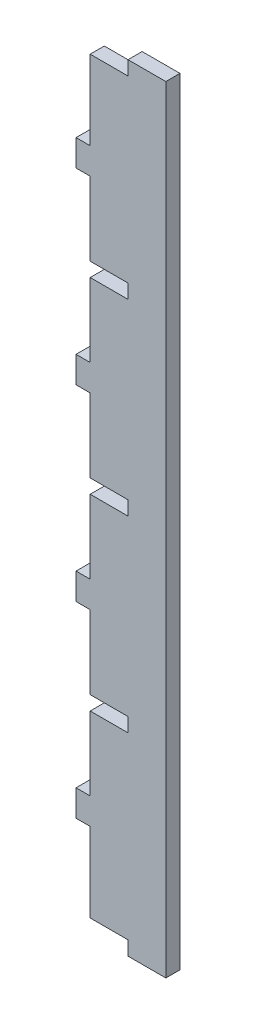
ISO-10303-21;
HEADER;
FILE_DESCRIPTION(('STEP AP214'),'2;1');
FILE_NAME('part.step','',(''),(''),'','','');
FILE_SCHEMA(('AUTOMOTIVE_DESIGN { 1 0 10303 214 1 1 1 1 }'));
ENDSEC;
DATA;
#1=APPLICATION_CONTEXT('core data for automotive mechanical design processes');
#2=APPLICATION_PROTOCOL_DEFINITION('international standard','automotive_design',2000,#1);
#3=PRODUCT_CONTEXT('',#1,'mechanical');
#4=PRODUCT('Part','Part','',(#3));
#5=PRODUCT_RELATED_PRODUCT_CATEGORY('part','',(#4));
#6=PRODUCT_DEFINITION_FORMATION('','',#4);
#7=PRODUCT_DEFINITION_CONTEXT('part definition',#1,'design');
#8=PRODUCT_DEFINITION('design','',#6,#7);
#9=PRODUCT_DEFINITION_SHAPE('','',#8);
#10=(LENGTH_UNIT() NAMED_UNIT(*) SI_UNIT(.MILLI.,.METRE.));
#11=(NAMED_UNIT(*) PLANE_ANGLE_UNIT() SI_UNIT($,.RADIAN.));
#12=(NAMED_UNIT(*) SI_UNIT($,.STERADIAN.) SOLID_ANGLE_UNIT());
#13=UNCERTAINTY_MEASURE_WITH_UNIT(LENGTH_MEASURE(1.E-05),#10,'distance_accuracy_value','');
#14=(GEOMETRIC_REPRESENTATION_CONTEXT(3) GLOBAL_UNCERTAINTY_ASSIGNED_CONTEXT((#13)) GLOBAL_UNIT_ASSIGNED_CONTEXT((#10,
#11,#12)) REPRESENTATION_CONTEXT('',''));
#15=CARTESIAN_POINT('',(0.,0.,0.));
#16=DIRECTION('',(0.,0.,1.));
#17=DIRECTION('',(1.,0.,0.));
#18=AXIS2_PLACEMENT_3D('',#15,#16,#17);
#19=CARTESIAN_POINT('',(5.34999929369997,5.3500086069,5.35));
#20=DIRECTION('',(0.,1.,0.));
#21=DIRECTION('',(0.,0.,1.));
#22=AXIS2_PLACEMENT_3D('',#19,#20,#21);
#23=PLANE('',#22);
#24=DIRECTION('',(1.,0.,0.));
#25=VECTOR('',#24,1.);
#26=CARTESIAN_POINT('',(5.34999929369997,5.3500086069,0.));
#27=LINE('',#26,#25);
#28=CARTESIAN_POINT('',(5.34999929369997,5.3500086069,0.));
#29=VERTEX_POINT('',#28);
#30=CARTESIAN_POINT('',(19.674999232,5.3500086069,0.));
#31=VERTEX_POINT('',#30);
#32=EDGE_CURVE('E297',#29,#31,#27,.T.);
#33=ORIENTED_EDGE('',*,*,#32,.T.);
#34=DIRECTION('',(0.,0.,-1.));
#35=VECTOR('',#34,1.);
#36=CARTESIAN_POINT('',(19.674999232,5.3500086069,5.35));
#37=LINE('',#36,#35);
#38=CARTESIAN_POINT('',(19.674999232,5.3500086069,5.35));
#39=VERTEX_POINT('',#38);
#40=EDGE_CURVE('E11',#39,#31,#37,.T.);
#41=ORIENTED_EDGE('',*,*,#40,.F.);
#42=DIRECTION('',(1.,0.,0.));
#43=VECTOR('',#42,1.);
#44=CARTESIAN_POINT('',(5.34999929369997,5.3500086069,5.35));
#45=LINE('',#44,#43);
#46=CARTESIAN_POINT('',(5.34999929369997,5.3500086069,5.35));
#47=VERTEX_POINT('',#46);
#48=EDGE_CURVE('E367',#47,#39,#45,.T.);
#49=ORIENTED_EDGE('',*,*,#48,.F.);
#50=DIRECTION('',(0.,0.,-1.));
#51=VECTOR('',#50,1.);
#52=CARTESIAN_POINT('',(5.34999929369997,5.3500086069,5.35));
#53=LINE('',#52,#51);
#54=EDGE_CURVE('E293',#47,#29,#53,.T.);
#55=ORIENTED_EDGE('',*,*,#54,.T.);
#56=EDGE_LOOP('',(#33,#41,#49,#55));
#57=FACE_BOUND('',#56,.T.);
#58=ADVANCED_FACE('F33',(#57),#23,.F.);
#59=CARTESIAN_POINT('',(19.674999232,5.3500086069,5.35));
#60=DIRECTION('',(1.,0.,0.));
#61=DIRECTION('',(0.,0.,-1.));
#62=AXIS2_PLACEMENT_3D('',#59,#60,#61);
#63=PLANE('',#62);
#64=DIRECTION('',(0.,-1.,0.));
#65=VECTOR('',#64,1.);
#66=CARTESIAN_POINT('',(19.674999232,5.3500086069,0.));
#67=LINE('',#66,#65);
#68=CARTESIAN_POINT('',(19.674999232,0.,0.));
#69=VERTEX_POINT('',#68);
#70=EDGE_CURVE('E300',#31,#69,#67,.T.);
#71=ORIENTED_EDGE('',*,*,#70,.T.);
#72=DIRECTION('',(0.,0.,-1.));
#73=VECTOR('',#72,1.);
#74=CARTESIAN_POINT('',(19.674999232,0.,5.35));
#75=LINE('',#74,#73);
#76=CARTESIAN_POINT('',(19.674999232,0.,5.35));
#77=VERTEX_POINT('',#76);
#78=EDGE_CURVE('E41',#77,#69,#75,.T.);
#79=ORIENTED_EDGE('',*,*,#78,.F.);
#80=DIRECTION('',(0.,-1.,0.));
#81=VECTOR('',#80,1.);
#82=CARTESIAN_POINT('',(19.674999232,5.3500086069,5.35));
#83=LINE('',#82,#81);
#84=EDGE_CURVE('E176',#39,#77,#83,.T.);
#85=ORIENTED_EDGE('',*,*,#84,.F.);
#86=ORIENTED_EDGE('',*,*,#40,.T.);
#87=EDGE_LOOP('',(#71,#79,#85,#86));
#88=FACE_BOUND('',#87,.T.);
#89=ADVANCED_FACE('F565',(#88),#63,.F.);
#90=CARTESIAN_POINT('',(19.674999232,0.,5.35));
#91=DIRECTION('',(0.,1.,0.));
#92=DIRECTION('',(0.,0.,1.));
#93=AXIS2_PLACEMENT_3D('',#90,#91,#92);
#94=PLANE('',#93);
#95=DIRECTION('',(1.,0.,0.));
#96=VECTOR('',#95,1.);
#97=CARTESIAN_POINT('',(19.674999232,0.,0.));
#98=LINE('',#97,#96);
#99=CARTESIAN_POINT('',(33.9999990538,0.,0.));
#100=VERTEX_POINT('',#99);
#101=EDGE_CURVE('E302',#69,#100,#98,.T.);
#102=ORIENTED_EDGE('',*,*,#101,.T.);
#103=DIRECTION('',(0.,0.,-1.));
#104=VECTOR('',#103,1.);
#105=CARTESIAN_POINT('',(33.9999990538,0.,5.35));
#106=LINE('',#105,#104);
#107=CARTESIAN_POINT('',(33.9999990538,0.,5.35));
#108=VERTEX_POINT('',#107);
#109=EDGE_CURVE('E458',#108,#100,#106,.T.);
#110=ORIENTED_EDGE('',*,*,#109,.F.);
#111=DIRECTION('',(1.,0.,0.));
#112=VECTOR('',#111,1.);
#113=CARTESIAN_POINT('',(19.674999232,0.,5.35));
#114=LINE('',#113,#112);
#115=EDGE_CURVE('E466',#77,#108,#114,.T.);
#116=ORIENTED_EDGE('',*,*,#115,.F.);
#117=ORIENTED_EDGE('',*,*,#78,.T.);
#118=EDGE_LOOP('',(#102,#110,#116,#117));
#119=FACE_BOUND('',#118,.T.);
#120=ADVANCED_FACE('F464',(#119),#94,.F.);
#121=CARTESIAN_POINT('',(33.9999990538,0.,5.35));
#122=DIRECTION('',(-1.,0.,0.));
#123=DIRECTION('',(0.,0.,1.));
#124=AXIS2_PLACEMENT_3D('',#121,#122,#123);
#125=PLANE('',#124);
#126=DIRECTION('',(0.,1.,0.));
#127=VECTOR('',#126,1.);
#128=CARTESIAN_POINT('',(33.9999990538,0.,0.));
#129=LINE('',#128,#127);
#130=CARTESIAN_POINT('',(33.9999990538,293.9999997616,0.));
#131=VERTEX_POINT('',#130);
#132=EDGE_CURVE('E304',#100,#131,#129,.T.);
#133=ORIENTED_EDGE('',*,*,#132,.T.);
#134=DIRECTION('',(0.,0.,-1.));
#135=VECTOR('',#134,1.);
#136=CARTESIAN_POINT('',(33.9999990538,293.9999997616,5.35));
#137=LINE('',#136,#135);
#138=CARTESIAN_POINT('',(33.9999990538,293.9999997616,5.35));
#139=VERTEX_POINT('',#138);
#140=EDGE_CURVE('E455',#139,#131,#137,.T.);
#141=ORIENTED_EDGE('',*,*,#140,.F.);
#142=DIRECTION('',(0.,1.,0.));
#143=VECTOR('',#142,1.);
#144=CARTESIAN_POINT('',(33.9999990538,0.,5.35));
#145=LINE('',#144,#143);
#146=EDGE_CURVE('E484',#108,#139,#145,.T.);
#147=ORIENTED_EDGE('',*,*,#146,.F.);
#148=ORIENTED_EDGE('',*,*,#109,.T.);
#149=EDGE_LOOP('',(#133,#141,#147,#148));
#150=FACE_BOUND('',#149,.T.);
#151=ADVANCED_FACE('F475',(#150),#125,.F.);
#152=CARTESIAN_POINT('',(33.9999990538,293.9999997616,5.35));
#153=DIRECTION('',(0.,-1.,0.));
#154=DIRECTION('',(0.,0.,-1.));
#155=AXIS2_PLACEMENT_3D('',#152,#153,#154);
#156=PLANE('',#155);
#157=DIRECTION('',(-1.,0.,0.));
#158=VECTOR('',#157,1.);
#159=CARTESIAN_POINT('',(33.9999990538,293.9999997616,0.));
#160=LINE('',#159,#158);
#161=CARTESIAN_POINT('',(19.674999232,293.9999997616,0.));
#162=VERTEX_POINT('',#161);
#163=EDGE_CURVE('E306',#131,#162,#160,.T.);
#164=ORIENTED_EDGE('',*,*,#163,.T.);
#165=DIRECTION('',(0.,0.,-1.));
#166=VECTOR('',#165,1.);
#167=CARTESIAN_POINT('',(19.674999232,293.9999997616,5.35));
#168=LINE('',#167,#166);
#169=CARTESIAN_POINT('',(19.674999232,293.9999997616,5.35));
#170=VERTEX_POINT('',#169);
#171=EDGE_CURVE('E452',#170,#162,#168,.T.);
#172=ORIENTED_EDGE('',*,*,#171,.F.);
#173=DIRECTION('',(-1.,0.,0.));
#174=VECTOR('',#173,1.);
#175=CARTESIAN_POINT('',(33.9999990538,293.9999997616,5.35));
#176=LINE('',#175,#174);
#177=EDGE_CURVE('E481',#139,#170,#176,.T.);
#178=ORIENTED_EDGE('',*,*,#177,.F.);
#179=ORIENTED_EDGE('',*,*,#140,.T.);
#180=EDGE_LOOP('',(#164,#172,#178,#179));
#181=FACE_BOUND('',#180,.T.);
#182=ADVANCED_FACE('F479',(#181),#156,.F.);
#183=CARTESIAN_POINT('',(19.674999232,293.9999997616,5.35));
#184=DIRECTION('',(1.,0.,0.));
#185=DIRECTION('',(0.,0.,-1.));
#186=AXIS2_PLACEMENT_3D('',#183,#184,#185);
#187=PLANE('',#186);
#188=DIRECTION('',(0.,-1.,0.));
#189=VECTOR('',#188,1.);
#190=CARTESIAN_POINT('',(19.674999232,293.9999997616,0.));
#191=LINE('',#190,#189);
#192=CARTESIAN_POINT('',(19.674999232,288.6500060559,0.));
#193=VERTEX_POINT('',#192);
#194=EDGE_CURVE('E308',#162,#193,#191,.T.);
#195=ORIENTED_EDGE('',*,*,#194,.T.);
#196=DIRECTION('',(0.,0.,-1.));
#197=VECTOR('',#196,1.);
#198=CARTESIAN_POINT('',(19.674999232,288.6500060559,5.35));
#199=LINE('',#198,#197);
#200=CARTESIAN_POINT('',(19.674999232,288.6500060559,5.35));
#201=VERTEX_POINT('',#200);
#202=EDGE_CURVE('E449',#201,#193,#199,.T.);
#203=ORIENTED_EDGE('',*,*,#202,.F.);
#204=DIRECTION('',(0.,-1.,0.));
#205=VECTOR('',#204,1.);
#206=CARTESIAN_POINT('',(19.674999232,293.9999997616,5.35));
#207=LINE('',#206,#205);
#208=EDGE_CURVE('E483',#170,#201,#207,.T.);
#209=ORIENTED_EDGE('',*,*,#208,.F.);
#210=ORIENTED_EDGE('',*,*,#171,.T.);
#211=EDGE_LOOP('',(#195,#203,#209,#210));
#212=FACE_BOUND('',#211,.T.);
#213=ADVANCED_FACE('F578',(#212),#187,.F.);
#214=CARTESIAN_POINT('',(19.674999232,288.6500060559,5.35));
#215=DIRECTION('',(0.,-1.,0.));
#216=DIRECTION('',(0.,0.,-1.));
#217=AXIS2_PLACEMENT_3D('',#214,#215,#216);
#218=PLANE('',#217);
#219=DIRECTION('',(-1.,0.,0.));
#220=VECTOR('',#219,1.);
#221=CARTESIAN_POINT('',(19.674999232,288.6500060559,0.));
#222=LINE('',#221,#220);
#223=CARTESIAN_POINT('',(5.34999929369997,288.6500060559,0.));
#224=VERTEX_POINT('',#223);
#225=EDGE_CURVE('E310',#193,#224,#222,.T.);
#226=ORIENTED_EDGE('',*,*,#225,.T.);
#227=DIRECTION('',(0.,0.,-1.));
#228=VECTOR('',#227,1.);
#229=CARTESIAN_POINT('',(5.34999929369997,288.6500060559,5.35));
#230=LINE('',#229,#228);
#231=CARTESIAN_POINT('',(5.34999929369997,288.6500060559,5.35));
#232=VERTEX_POINT('',#231);
#233=EDGE_CURVE('E446',#232,#224,#230,.T.);
#234=ORIENTED_EDGE('',*,*,#233,.F.);
#235=DIRECTION('',(-1.,0.,0.));
#236=VECTOR('',#235,1.);
#237=CARTESIAN_POINT('',(19.674999232,288.6500060559,5.35));
#238=LINE('',#237,#236);
#239=EDGE_CURVE('E486',#201,#232,#238,.T.);
#240=ORIENTED_EDGE('',*,*,#239,.F.);
#241=ORIENTED_EDGE('',*,*,#202,.T.);
#242=EDGE_LOOP('',(#226,#234,#240,#241));
#243=FACE_BOUND('',#242,.T.);
#244=ADVANCED_FACE('F581',(#243),#218,.F.);
#245=CARTESIAN_POINT('',(5.34999929369997,288.6500060559,5.35));
#246=DIRECTION('',(1.,0.,0.));
#247=DIRECTION('',(0.,0.,-1.));
#248=AXIS2_PLACEMENT_3D('',#245,#246,#247);
#249=PLANE('',#248);
#250=DIRECTION('',(0.,-1.,0.));
#251=VECTOR('',#250,1.);
#252=CARTESIAN_POINT('',(5.34999929369997,288.6500060559,0.));
#253=LINE('',#252,#251);
#254=CARTESIAN_POINT('',(5.34999929369997,258.6180120707,0.));
#255=VERTEX_POINT('',#254);
#256=EDGE_CURVE('E312',#224,#255,#253,.T.);
#257=ORIENTED_EDGE('',*,*,#256,.T.);
#258=DIRECTION('',(0.,0.,-1.));
#259=VECTOR('',#258,1.);
#260=CARTESIAN_POINT('',(5.34999929369997,258.6180120707,5.35));
#261=LINE('',#260,#259);
#262=CARTESIAN_POINT('',(5.34999929369997,258.6180120707,5.35));
#263=VERTEX_POINT('',#262);
#264=EDGE_CURVE('E443',#263,#255,#261,.T.);
#265=ORIENTED_EDGE('',*,*,#264,.F.);
#266=DIRECTION('',(0.,-1.,0.));
#267=VECTOR('',#266,1.);
#268=CARTESIAN_POINT('',(5.34999929369997,288.6500060559,5.35));
#269=LINE('',#268,#267);
#270=EDGE_CURVE('E492',#232,#263,#269,.T.);
#271=ORIENTED_EDGE('',*,*,#270,.F.);
#272=ORIENTED_EDGE('',*,*,#233,.T.);
#273=EDGE_LOOP('',(#257,#265,#271,#272));
#274=FACE_BOUND('',#273,.T.);
#275=ADVANCED_FACE('F585',(#274),#249,.F.);
#276=CARTESIAN_POINT('',(5.34999929369997,258.6180120707,5.35));
#277=DIRECTION('',(0.,-1.,0.));
#278=DIRECTION('',(0.,0.,-1.));
#279=AXIS2_PLACEMENT_3D('',#276,#277,#278);
#280=PLANE('',#279);
#281=DIRECTION('',(-1.,0.,0.));
#282=VECTOR('',#281,1.);
#283=CARTESIAN_POINT('',(5.34999929369997,258.6180120707,0.));
#284=LINE('',#283,#282);
#285=CARTESIAN_POINT('',(0.,258.6180120707,0.));
#286=VERTEX_POINT('',#285);
#287=EDGE_CURVE('E314',#255,#286,#284,.T.);
#288=ORIENTED_EDGE('',*,*,#287,.T.);
#289=DIRECTION('',(0.,0.,-1.));
#290=VECTOR('',#289,1.);
#291=CARTESIAN_POINT('',(0.,258.6180120707,5.35));
#292=LINE('',#291,#290);
#293=CARTESIAN_POINT('',(0.,258.6180120707,5.35));
#294=VERTEX_POINT('',#293);
#295=EDGE_CURVE('E440',#294,#286,#292,.T.);
#296=ORIENTED_EDGE('',*,*,#295,.F.);
#297=DIRECTION('',(-1.,0.,0.));
#298=VECTOR('',#297,1.);
#299=CARTESIAN_POINT('',(5.34999929369997,258.6180120707,5.35));
#300=LINE('',#299,#298);
#301=EDGE_CURVE('E494',#263,#294,#300,.T.);
#302=ORIENTED_EDGE('',*,*,#301,.F.);
#303=ORIENTED_EDGE('',*,*,#264,.T.);
#304=EDGE_LOOP('',(#288,#296,#302,#303));
#305=FACE_BOUND('',#304,.T.);
#306=ADVANCED_FACE('F589',(#305),#280,.F.);
#307=CARTESIAN_POINT('',(0.,258.6180120707,5.35));
#308=DIRECTION('',(1.,0.,0.));
#309=DIRECTION('',(0.,0.,-1.));
#310=AXIS2_PLACEMENT_3D('',#307,#308,#309);
#311=PLANE('',#310);
#312=DIRECTION('',(0.,-1.,0.));
#313=VECTOR('',#312,1.);
#314=CARTESIAN_POINT('',(0.,258.6180120707,0.));
#315=LINE('',#314,#313);
#316=CARTESIAN_POINT('',(0.,248.6180067063,0.));
#317=VERTEX_POINT('',#316);
#318=EDGE_CURVE('E316',#286,#317,#315,.T.);
#319=ORIENTED_EDGE('',*,*,#318,.T.);
#320=DIRECTION('',(0.,0.,-1.));
#321=VECTOR('',#320,1.);
#322=CARTESIAN_POINT('',(0.,248.6180067063,5.35));
#323=LINE('',#322,#321);
#324=CARTESIAN_POINT('',(0.,248.6180067063,5.35));
#325=VERTEX_POINT('',#324);
#326=EDGE_CURVE('E437',#325,#317,#323,.T.);
#327=ORIENTED_EDGE('',*,*,#326,.F.);
#328=DIRECTION('',(0.,-1.,0.));
#329=VECTOR('',#328,1.);
#330=CARTESIAN_POINT('',(0.,258.6180120707,5.35));
#331=LINE('',#330,#329);
#332=EDGE_CURVE('E496',#294,#325,#331,.T.);
#333=ORIENTED_EDGE('',*,*,#332,.F.);
#334=ORIENTED_EDGE('',*,*,#295,.T.);
#335=EDGE_LOOP('',(#319,#327,#333,#334));
#336=FACE_BOUND('',#335,.T.);
#337=ADVANCED_FACE('F593',(#336),#311,.F.);
#338=CARTESIAN_POINT('',(0.,248.6180067063,5.35));
#339=DIRECTION('',(0.,1.,0.));
#340=DIRECTION('',(0.,0.,1.));
#341=AXIS2_PLACEMENT_3D('',#338,#339,#340);
#342=PLANE('',#341);
#343=DIRECTION('',(1.,0.,0.));
#344=VECTOR('',#343,1.);
#345=CARTESIAN_POINT('',(0.,248.6180067063,0.));
#346=LINE('',#345,#344);
#347=CARTESIAN_POINT('',(5.34999929369997,248.6180067063,0.));
#348=VERTEX_POINT('',#347);
#349=EDGE_CURVE('E318',#317,#348,#346,.T.);
#350=ORIENTED_EDGE('',*,*,#349,.T.);
#351=DIRECTION('',(0.,0.,-1.));
#352=VECTOR('',#351,1.);
#353=CARTESIAN_POINT('',(5.34999929369997,248.6180067063,5.35));
#354=LINE('',#353,#352);
#355=CARTESIAN_POINT('',(5.34999929369997,248.6180067063,5.35));
#356=VERTEX_POINT('',#355);
#357=EDGE_CURVE('E434',#356,#348,#354,.T.);
#358=ORIENTED_EDGE('',*,*,#357,.F.);
#359=DIRECTION('',(1.,0.,0.));
#360=VECTOR('',#359,1.);
#361=CARTESIAN_POINT('',(0.,248.6180067063,5.35));
#362=LINE('',#361,#360);
#363=EDGE_CURVE('E498',#325,#356,#362,.T.);
#364=ORIENTED_EDGE('',*,*,#363,.F.);
#365=ORIENTED_EDGE('',*,*,#326,.T.);
#366=EDGE_LOOP('',(#350,#358,#364,#365));
#367=FACE_BOUND('',#366,.T.);
#368=ADVANCED_FACE('F597',(#367),#342,.F.);
#369=CARTESIAN_POINT('',(5.34999929369997,248.6180067063,5.35));
#370=DIRECTION('',(1.,0.,0.));
#371=DIRECTION('',(0.,0.,-1.));
#372=AXIS2_PLACEMENT_3D('',#369,#370,#371);
#373=PLANE('',#372);
#374=DIRECTION('',(0.,-1.,0.));
#375=VECTOR('',#374,1.);
#376=CARTESIAN_POINT('',(5.34999929369997,248.6180067063,0.));
#377=LINE('',#376,#375);
#378=CARTESIAN_POINT('',(5.34999929369997,220.7536697388,0.));
#379=VERTEX_POINT('',#378);
#380=EDGE_CURVE('E320',#348,#379,#377,.T.);
#381=ORIENTED_EDGE('',*,*,#380,.T.);
#382=DIRECTION('',(0.,0.,-1.));
#383=VECTOR('',#382,1.);
#384=CARTESIAN_POINT('',(5.34999929369997,220.7536697388,5.35));
#385=LINE('',#384,#383);
#386=CARTESIAN_POINT('',(5.34999929369997,220.7536697388,5.35));
#387=VERTEX_POINT('',#386);
#388=EDGE_CURVE('E431',#387,#379,#385,.T.);
#389=ORIENTED_EDGE('',*,*,#388,.F.);
#390=DIRECTION('',(0.,-1.,0.));
#391=VECTOR('',#390,1.);
#392=CARTESIAN_POINT('',(5.34999929369997,248.6180067063,5.35));
#393=LINE('',#392,#391);
#394=EDGE_CURVE('E500',#356,#387,#393,.T.);
#395=ORIENTED_EDGE('',*,*,#394,.F.);
#396=ORIENTED_EDGE('',*,*,#357,.T.);
#397=EDGE_LOOP('',(#381,#389,#395,#396));
#398=FACE_BOUND('',#397,.T.);
#399=ADVANCED_FACE('F601',(#398),#373,.F.);
#400=CARTESIAN_POINT('',(5.34999929369997,220.7536697388,5.35));
#401=DIRECTION('',(0.,1.,0.));
#402=DIRECTION('',(0.,0.,1.));
#403=AXIS2_PLACEMENT_3D('',#400,#401,#402);
#404=PLANE('',#403);
#405=DIRECTION('',(1.,0.,0.));
#406=VECTOR('',#405,1.);
#407=CARTESIAN_POINT('',(5.34999929369997,220.7536697388,0.));
#408=LINE('',#407,#406);
#409=CARTESIAN_POINT('',(19.674999232,220.7536697388,0.));
#410=VERTEX_POINT('',#409);
#411=EDGE_CURVE('E322',#379,#410,#408,.T.);
#412=ORIENTED_EDGE('',*,*,#411,.T.);
#413=DIRECTION('',(0.,0.,-1.));
#414=VECTOR('',#413,1.);
#415=CARTESIAN_POINT('',(19.674999232,220.7536697388,5.35));
#416=LINE('',#415,#414);
#417=CARTESIAN_POINT('',(19.674999232,220.7536697388,5.35));
#418=VERTEX_POINT('',#417);
#419=EDGE_CURVE('E428',#418,#410,#416,.T.);
#420=ORIENTED_EDGE('',*,*,#419,.F.);
#421=DIRECTION('',(1.,0.,0.));
#422=VECTOR('',#421,1.);
#423=CARTESIAN_POINT('',(5.34999929369997,220.7536697388,5.35));
#424=LINE('',#423,#422);
#425=EDGE_CURVE('E502',#387,#418,#424,.T.);
#426=ORIENTED_EDGE('',*,*,#425,.F.);
#427=ORIENTED_EDGE('',*,*,#388,.T.);
#428=EDGE_LOOP('',(#412,#420,#426,#427));
#429=FACE_BOUND('',#428,.T.);
#430=ADVANCED_FACE('F605',(#429),#404,.F.);
#431=CARTESIAN_POINT('',(19.674999232,220.7536697388,5.35));
#432=DIRECTION('',(1.,0.,0.));
#433=DIRECTION('',(0.,0.,-1.));
#434=AXIS2_PLACEMENT_3D('',#431,#432,#433);
#435=PLANE('',#434);
#436=DIRECTION('',(0.,-1.,0.));
#437=VECTOR('',#436,1.);
#438=CARTESIAN_POINT('',(19.674999232,220.7536697388,0.));
#439=LINE('',#438,#437);
#440=CARTESIAN_POINT('',(19.674999232,215.4036760331,0.));
#441=VERTEX_POINT('',#440);
#442=EDGE_CURVE('E324',#410,#441,#439,.T.);
#443=ORIENTED_EDGE('',*,*,#442,.T.);
#444=DIRECTION('',(0.,0.,-1.));
#445=VECTOR('',#444,1.);
#446=CARTESIAN_POINT('',(19.674999232,215.4036760331,5.35));
#447=LINE('',#446,#445);
#448=CARTESIAN_POINT('',(19.674999232,215.4036760331,5.35));
#449=VERTEX_POINT('',#448);
#450=EDGE_CURVE('E425',#449,#441,#447,.T.);
#451=ORIENTED_EDGE('',*,*,#450,.F.);
#452=DIRECTION('',(0.,-1.,0.));
#453=VECTOR('',#452,1.);
#454=CARTESIAN_POINT('',(19.674999232,220.7536697388,5.35));
#455=LINE('',#454,#453);
#456=EDGE_CURVE('E504',#418,#449,#455,.T.);
#457=ORIENTED_EDGE('',*,*,#456,.F.);
#458=ORIENTED_EDGE('',*,*,#419,.T.);
#459=EDGE_LOOP('',(#443,#451,#457,#458));
#460=FACE_BOUND('',#459,.T.);
#461=ADVANCED_FACE('F609',(#460),#435,.F.);
#462=CARTESIAN_POINT('',(19.674999232,215.4036760331,5.35));
#463=DIRECTION('',(0.,-1.,0.));
#464=DIRECTION('',(0.,0.,-1.));
#465=AXIS2_PLACEMENT_3D('',#462,#463,#464);
#466=PLANE('',#465);
#467=DIRECTION('',(-1.,0.,0.));
#468=VECTOR('',#467,1.);
#469=CARTESIAN_POINT('',(19.674999232,215.4036760331,0.));
#470=LINE('',#469,#468);
#471=CARTESIAN_POINT('',(5.34999929369997,215.4036760331,0.));
#472=VERTEX_POINT('',#471);
#473=EDGE_CURVE('E326',#441,#472,#470,.T.);
#474=ORIENTED_EDGE('',*,*,#473,.T.);
#475=DIRECTION('',(0.,0.,-1.));
#476=VECTOR('',#475,1.);
#477=CARTESIAN_POINT('',(5.34999929369997,215.4036760331,5.35));
#478=LINE('',#477,#476);
#479=CARTESIAN_POINT('',(5.34999929369997,215.4036760331,5.35));
#480=VERTEX_POINT('',#479);
#481=EDGE_CURVE('E422',#480,#472,#478,.T.);
#482=ORIENTED_EDGE('',*,*,#481,.F.);
#483=DIRECTION('',(-1.,0.,0.));
#484=VECTOR('',#483,1.);
#485=CARTESIAN_POINT('',(19.674999232,215.4036760331,5.35));
#486=LINE('',#485,#484);
#487=EDGE_CURVE('E506',#449,#480,#486,.T.);
#488=ORIENTED_EDGE('',*,*,#487,.F.);
#489=ORIENTED_EDGE('',*,*,#450,.T.);
#490=EDGE_LOOP('',(#474,#482,#488,#489));
#491=FACE_BOUND('',#490,.T.);
#492=ADVANCED_FACE('F613',(#491),#466,.F.);
#493=CARTESIAN_POINT('',(5.34999929369997,215.4036760331,5.35));
#494=DIRECTION('',(1.,0.,0.));
#495=DIRECTION('',(0.,0.,-1.));
#496=AXIS2_PLACEMENT_3D('',#493,#494,#495);
#497=PLANE('',#496);
#498=DIRECTION('',(0.,-1.,0.));
#499=VECTOR('',#498,1.);
#500=CARTESIAN_POINT('',(5.34999929369997,215.4036760331,0.));
#501=LINE('',#500,#499);
#502=CARTESIAN_POINT('',(5.34999929369997,187.5393390656,0.));
#503=VERTEX_POINT('',#502);
#504=EDGE_CURVE('E328',#472,#503,#501,.T.);
#505=ORIENTED_EDGE('',*,*,#504,.T.);
#506=DIRECTION('',(0.,0.,-1.));
#507=VECTOR('',#506,1.);
#508=CARTESIAN_POINT('',(5.34999929369997,187.5393390656,5.35));
#509=LINE('',#508,#507);
#510=CARTESIAN_POINT('',(5.34999929369997,187.5393390656,5.35));
#511=VERTEX_POINT('',#510);
#512=EDGE_CURVE('E419',#511,#503,#509,.T.);
#513=ORIENTED_EDGE('',*,*,#512,.F.);
#514=DIRECTION('',(0.,-1.,0.));
#515=VECTOR('',#514,1.);
#516=CARTESIAN_POINT('',(5.34999929369997,215.4036760331,5.35));
#517=LINE('',#516,#515);
#518=EDGE_CURVE('E508',#480,#511,#517,.T.);
#519=ORIENTED_EDGE('',*,*,#518,.F.);
#520=ORIENTED_EDGE('',*,*,#481,.T.);
#521=EDGE_LOOP('',(#505,#513,#519,#520));
#522=FACE_BOUND('',#521,.T.);
#523=ADVANCED_FACE('F617',(#522),#497,.F.);
#524=CARTESIAN_POINT('',(5.34999929369997,187.5393390656,5.35));
#525=DIRECTION('',(0.,-1.,0.));
#526=DIRECTION('',(0.,0.,-1.));
#527=AXIS2_PLACEMENT_3D('',#524,#525,#526);
#528=PLANE('',#527);
#529=DIRECTION('',(-1.,0.,0.));
#530=VECTOR('',#529,1.);
#531=CARTESIAN_POINT('',(5.34999929369997,187.5393390656,0.));
#532=LINE('',#531,#530);
#533=CARTESIAN_POINT('',(0.,187.5393390656,0.));
#534=VERTEX_POINT('',#533);
#535=EDGE_CURVE('E330',#503,#534,#532,.T.);
#536=ORIENTED_EDGE('',*,*,#535,.T.);
#537=DIRECTION('',(0.,0.,-1.));
#538=VECTOR('',#537,1.);
#539=CARTESIAN_POINT('',(0.,187.5393390656,5.35));
#540=LINE('',#539,#538);
#541=CARTESIAN_POINT('',(0.,187.5393390656,5.35));
#542=VERTEX_POINT('',#541);
#543=EDGE_CURVE('E416',#542,#534,#540,.T.);
#544=ORIENTED_EDGE('',*,*,#543,.F.);
#545=DIRECTION('',(-1.,0.,0.));
#546=VECTOR('',#545,1.);
#547=CARTESIAN_POINT('',(5.34999929369997,187.5393390656,5.35));
#548=LINE('',#547,#546);
#549=EDGE_CURVE('E510',#511,#542,#548,.T.);
#550=ORIENTED_EDGE('',*,*,#549,.F.);
#551=ORIENTED_EDGE('',*,*,#512,.T.);
#552=EDGE_LOOP('',(#536,#544,#550,#551));
#553=FACE_BOUND('',#552,.T.);
#554=ADVANCED_FACE('F621',(#553),#528,.F.);
#555=CARTESIAN_POINT('',(0.,187.5393390656,5.35));
#556=DIRECTION('',(1.,0.,0.));
#557=DIRECTION('',(0.,0.,-1.));
#558=AXIS2_PLACEMENT_3D('',#555,#556,#557);
#559=PLANE('',#558);
#560=DIRECTION('',(0.,-1.,0.));
#561=VECTOR('',#560,1.);
#562=CARTESIAN_POINT('',(0.,187.5393390656,0.));
#563=LINE('',#562,#561);
#564=CARTESIAN_POINT('',(0.,177.5393411517,0.));
#565=VERTEX_POINT('',#564);
#566=EDGE_CURVE('E332',#534,#565,#563,.T.);
#567=ORIENTED_EDGE('',*,*,#566,.T.);
#568=DIRECTION('',(0.,0.,-1.));
#569=VECTOR('',#568,1.);
#570=CARTESIAN_POINT('',(0.,177.5393411517,5.35));
#571=LINE('',#570,#569);
#572=CARTESIAN_POINT('',(0.,177.5393411517,5.35));
#573=VERTEX_POINT('',#572);
#574=EDGE_CURVE('E413',#573,#565,#571,.T.);
#575=ORIENTED_EDGE('',*,*,#574,.F.);
#576=DIRECTION('',(0.,-1.,0.));
#577=VECTOR('',#576,1.);
#578=CARTESIAN_POINT('',(0.,187.5393390656,5.35));
#579=LINE('',#578,#577);
#580=EDGE_CURVE('E512',#542,#573,#579,.T.);
#581=ORIENTED_EDGE('',*,*,#580,.F.);
#582=ORIENTED_EDGE('',*,*,#543,.T.);
#583=EDGE_LOOP('',(#567,#575,#581,#582));
#584=FACE_BOUND('',#583,.T.);
#585=ADVANCED_FACE('F625',(#584),#559,.F.);
#586=CARTESIAN_POINT('',(0.,177.5393411517,5.35));
#587=DIRECTION('',(0.,1.,0.));
#588=DIRECTION('',(0.,0.,1.));
#589=AXIS2_PLACEMENT_3D('',#586,#587,#588);
#590=PLANE('',#589);
#591=DIRECTION('',(1.,0.,0.));
#592=VECTOR('',#591,1.);
#593=CARTESIAN_POINT('',(0.,177.5393411517,0.));
#594=LINE('',#593,#592);
#595=CARTESIAN_POINT('',(5.34999929369997,177.5393411517,0.));
#596=VERTEX_POINT('',#595);
#597=EDGE_CURVE('E334',#565,#596,#594,.T.);
#598=ORIENTED_EDGE('',*,*,#597,.T.);
#599=DIRECTION('',(0.,0.,-1.));
#600=VECTOR('',#599,1.);
#601=CARTESIAN_POINT('',(5.34999929369997,177.5393411517,5.35));
#602=LINE('',#601,#600);
#603=CARTESIAN_POINT('',(5.34999929369997,177.5393411517,5.35));
#604=VERTEX_POINT('',#603);
#605=EDGE_CURVE('E410',#604,#596,#602,.T.);
#606=ORIENTED_EDGE('',*,*,#605,.F.);
#607=DIRECTION('',(1.,0.,0.));
#608=VECTOR('',#607,1.);
#609=CARTESIAN_POINT('',(0.,177.5393411517,5.35));
#610=LINE('',#609,#608);
#611=EDGE_CURVE('E514',#573,#604,#610,.T.);
#612=ORIENTED_EDGE('',*,*,#611,.F.);
#613=ORIENTED_EDGE('',*,*,#574,.T.);
#614=EDGE_LOOP('',(#598,#606,#612,#613));
#615=FACE_BOUND('',#614,.T.);
#616=ADVANCED_FACE('F629',(#615),#590,.F.);
#617=CARTESIAN_POINT('',(5.34999929369997,177.5393411517,5.35));
#618=DIRECTION('',(1.,0.,0.));
#619=DIRECTION('',(0.,0.,-1.));
#620=AXIS2_PLACEMENT_3D('',#617,#618,#619);
#621=PLANE('',#620);
#622=DIRECTION('',(0.,-1.,0.));
#623=VECTOR('',#622,1.);
#624=CARTESIAN_POINT('',(5.34999929369997,177.5393411517,0.));
#625=LINE('',#624,#623);
#626=CARTESIAN_POINT('',(5.34999929369997,149.6750060469,0.));
#627=VERTEX_POINT('',#626);
#628=EDGE_CURVE('E336',#596,#627,#625,.T.);
#629=ORIENTED_EDGE('',*,*,#628,.T.);
#630=DIRECTION('',(0.,0.,-1.));
#631=VECTOR('',#630,1.);
#632=CARTESIAN_POINT('',(5.34999929369997,149.6750060469,5.35));
#633=LINE('',#632,#631);
#634=CARTESIAN_POINT('',(5.34999929369997,149.6750060469,5.35));
#635=VERTEX_POINT('',#634);
#636=EDGE_CURVE('E407',#635,#627,#633,.T.);
#637=ORIENTED_EDGE('',*,*,#636,.F.);
#638=DIRECTION('',(0.,-1.,0.));
#639=VECTOR('',#638,1.);
#640=CARTESIAN_POINT('',(5.34999929369997,177.5393411517,5.35));
#641=LINE('',#640,#639);
#642=EDGE_CURVE('E516',#604,#635,#641,.T.);
#643=ORIENTED_EDGE('',*,*,#642,.F.);
#644=ORIENTED_EDGE('',*,*,#605,.T.);
#645=EDGE_LOOP('',(#629,#637,#643,#644));
#646=FACE_BOUND('',#645,.T.);
#647=ADVANCED_FACE('F633',(#646),#621,.F.);
#648=CARTESIAN_POINT('',(5.34999929369997,149.6750060469,5.35));
#649=DIRECTION('',(0.,1.,0.));
#650=DIRECTION('',(0.,0.,1.));
#651=AXIS2_PLACEMENT_3D('',#648,#649,#650);
#652=PLANE('',#651);
#653=DIRECTION('',(1.,0.,0.));
#654=VECTOR('',#653,1.);
#655=CARTESIAN_POINT('',(5.34999929369997,149.6750060469,0.));
#656=LINE('',#655,#654);
#657=CARTESIAN_POINT('',(19.674999232,149.6750060469,0.));
#658=VERTEX_POINT('',#657);
#659=EDGE_CURVE('E338',#627,#658,#656,.T.);
#660=ORIENTED_EDGE('',*,*,#659,.T.);
#661=DIRECTION('',(0.,0.,-1.));
#662=VECTOR('',#661,1.);
#663=CARTESIAN_POINT('',(19.674999232,149.6750060469,5.35));
#664=LINE('',#663,#662);
#665=CARTESIAN_POINT('',(19.674999232,149.6750060469,5.35));
#666=VERTEX_POINT('',#665);
#667=EDGE_CURVE('E404',#666,#658,#664,.T.);
#668=ORIENTED_EDGE('',*,*,#667,.F.);
#669=DIRECTION('',(1.,0.,0.));
#670=VECTOR('',#669,1.);
#671=CARTESIAN_POINT('',(5.34999929369997,149.6750060469,5.35));
#672=LINE('',#671,#670);
#673=EDGE_CURVE('E518',#635,#666,#672,.T.);
#674=ORIENTED_EDGE('',*,*,#673,.F.);
#675=ORIENTED_EDGE('',*,*,#636,.T.);
#676=EDGE_LOOP('',(#660,#668,#674,#675));
#677=FACE_BOUND('',#676,.T.);
#678=ADVANCED_FACE('F637',(#677),#652,.F.);
#679=CARTESIAN_POINT('',(19.674999232,149.6750060469,5.35));
#680=DIRECTION('',(1.,0.,0.));
#681=DIRECTION('',(0.,0.,-1.));
#682=AXIS2_PLACEMENT_3D('',#679,#680,#681);
#683=PLANE('',#682);
#684=DIRECTION('',(0.,-1.,0.));
#685=VECTOR('',#684,1.);
#686=CARTESIAN_POINT('',(19.674999232,149.6750060469,0.));
#687=LINE('',#686,#685);
#688=CARTESIAN_POINT('',(19.674999232,144.3250067532,0.));
#689=VERTEX_POINT('',#688);
#690=EDGE_CURVE('E340',#658,#689,#687,.T.);
#691=ORIENTED_EDGE('',*,*,#690,.T.);
#692=DIRECTION('',(0.,0.,-1.));
#693=VECTOR('',#692,1.);
#694=CARTESIAN_POINT('',(19.674999232,144.3250067532,5.35));
#695=LINE('',#694,#693);
#696=CARTESIAN_POINT('',(19.674999232,144.3250067532,5.35));
#697=VERTEX_POINT('',#696);
#698=EDGE_CURVE('E401',#697,#689,#695,.T.);
#699=ORIENTED_EDGE('',*,*,#698,.F.);
#700=DIRECTION('',(0.,-1.,0.));
#701=VECTOR('',#700,1.);
#702=CARTESIAN_POINT('',(19.674999232,149.6750060469,5.35));
#703=LINE('',#702,#701);
#704=EDGE_CURVE('E520',#666,#697,#703,.T.);
#705=ORIENTED_EDGE('',*,*,#704,.F.);
#706=ORIENTED_EDGE('',*,*,#667,.T.);
#707=EDGE_LOOP('',(#691,#699,#705,#706));
#708=FACE_BOUND('',#707,.T.);
#709=ADVANCED_FACE('F641',(#708),#683,.F.);
#710=CARTESIAN_POINT('',(19.674999232,144.3250067532,5.35));
#711=DIRECTION('',(0.,-1.,0.));
#712=DIRECTION('',(0.,0.,-1.));
#713=AXIS2_PLACEMENT_3D('',#710,#711,#712);
#714=PLANE('',#713);
#715=DIRECTION('',(-1.,0.,0.));
#716=VECTOR('',#715,1.);
#717=CARTESIAN_POINT('',(19.674999232,144.3250067532,0.));
#718=LINE('',#717,#716);
#719=CARTESIAN_POINT('',(5.34999929369997,144.3250067532,0.));
#720=VERTEX_POINT('',#719);
#721=EDGE_CURVE('E342',#689,#720,#718,.T.);
#722=ORIENTED_EDGE('',*,*,#721,.T.);
#723=DIRECTION('',(0.,0.,-1.));
#724=VECTOR('',#723,1.);
#725=CARTESIAN_POINT('',(5.34999929369997,144.3250067532,5.35));
#726=LINE('',#725,#724);
#727=CARTESIAN_POINT('',(5.34999929369997,144.3250067532,5.35));
#728=VERTEX_POINT('',#727);
#729=EDGE_CURVE('E398',#728,#720,#726,.T.);
#730=ORIENTED_EDGE('',*,*,#729,.F.);
#731=DIRECTION('',(-1.,0.,0.));
#732=VECTOR('',#731,1.);
#733=CARTESIAN_POINT('',(19.674999232,144.3250067532,5.35));
#734=LINE('',#733,#732);
#735=EDGE_CURVE('E522',#697,#728,#734,.T.);
#736=ORIENTED_EDGE('',*,*,#735,.F.);
#737=ORIENTED_EDGE('',*,*,#698,.T.);
#738=EDGE_LOOP('',(#722,#730,#736,#737));
#739=FACE_BOUND('',#738,.T.);
#740=ADVANCED_FACE('F645',(#739),#714,.F.);
#741=CARTESIAN_POINT('',(5.34999929369997,144.3250067532,5.35));
#742=DIRECTION('',(1.,0.,0.));
#743=DIRECTION('',(0.,0.,-1.));
#744=AXIS2_PLACEMENT_3D('',#741,#742,#743);
#745=PLANE('',#744);
#746=DIRECTION('',(0.,-1.,0.));
#747=VECTOR('',#746,1.);
#748=CARTESIAN_POINT('',(5.34999929369997,144.3250067532,0.));
#749=LINE('',#748,#747);
#750=CARTESIAN_POINT('',(5.34999929369997,116.4606725797,0.));
#751=VERTEX_POINT('',#750);
#752=EDGE_CURVE('E344',#720,#751,#749,.T.);
#753=ORIENTED_EDGE('',*,*,#752,.T.);
#754=DIRECTION('',(0.,0.,-1.));
#755=VECTOR('',#754,1.);
#756=CARTESIAN_POINT('',(5.34999929369997,116.4606725797,5.35));
#757=LINE('',#756,#755);
#758=CARTESIAN_POINT('',(5.34999929369997,116.4606725797,5.35));
#759=VERTEX_POINT('',#758);
#760=EDGE_CURVE('E395',#759,#751,#757,.T.);
#761=ORIENTED_EDGE('',*,*,#760,.F.);
#762=DIRECTION('',(0.,-1.,0.));
#763=VECTOR('',#762,1.);
#764=CARTESIAN_POINT('',(5.34999929369997,144.3250067532,5.35));
#765=LINE('',#764,#763);
#766=EDGE_CURVE('E524',#728,#759,#765,.T.);
#767=ORIENTED_EDGE('',*,*,#766,.F.);
#768=ORIENTED_EDGE('',*,*,#729,.T.);
#769=EDGE_LOOP('',(#753,#761,#767,#768));
#770=FACE_BOUND('',#769,.T.);
#771=ADVANCED_FACE('F649',(#770),#745,.F.);
#772=CARTESIAN_POINT('',(5.34999929369997,116.4606725797,5.35));
#773=DIRECTION('',(0.,-1.,0.));
#774=DIRECTION('',(0.,0.,-1.));
#775=AXIS2_PLACEMENT_3D('',#772,#773,#774);
#776=PLANE('',#775);
#777=DIRECTION('',(-1.,0.,0.));
#778=VECTOR('',#777,1.);
#779=CARTESIAN_POINT('',(5.34999929369997,116.4606725797,0.));
#780=LINE('',#779,#778);
#781=CARTESIAN_POINT('',(0.,116.4606725797,0.));
#782=VERTEX_POINT('',#781);
#783=EDGE_CURVE('E346',#751,#782,#780,.T.);
#784=ORIENTED_EDGE('',*,*,#783,.T.);
#785=DIRECTION('',(0.,0.,-1.));
#786=VECTOR('',#785,1.);
#787=CARTESIAN_POINT('',(0.,116.4606725797,5.35));
#788=LINE('',#787,#786);
#789=CARTESIAN_POINT('',(0.,116.4606725797,5.35));
#790=VERTEX_POINT('',#789);
#791=EDGE_CURVE('E392',#790,#782,#788,.T.);
#792=ORIENTED_EDGE('',*,*,#791,.F.);
#793=DIRECTION('',(-1.,0.,0.));
#794=VECTOR('',#793,1.);
#795=CARTESIAN_POINT('',(5.34999929369997,116.4606725797,5.35));
#796=LINE('',#795,#794);
#797=EDGE_CURVE('E526',#759,#790,#796,.T.);
#798=ORIENTED_EDGE('',*,*,#797,.F.);
#799=ORIENTED_EDGE('',*,*,#760,.T.);
#800=EDGE_LOOP('',(#784,#792,#798,#799));
#801=FACE_BOUND('',#800,.T.);
#802=ADVANCED_FACE('F653',(#801),#776,.F.);
#803=CARTESIAN_POINT('',(0.,116.4606725797,5.35));
#804=DIRECTION('',(1.,0.,0.));
#805=DIRECTION('',(0.,0.,-1.));
#806=AXIS2_PLACEMENT_3D('',#803,#804,#805);
#807=PLANE('',#806);
#808=DIRECTION('',(0.,-1.,0.));
#809=VECTOR('',#808,1.);
#810=CARTESIAN_POINT('',(0.,116.4606725797,0.));
#811=LINE('',#810,#809);
#812=CARTESIAN_POINT('',(0.,106.4606737346,0.));
#813=VERTEX_POINT('',#812);
#814=EDGE_CURVE('E348',#782,#813,#811,.T.);
#815=ORIENTED_EDGE('',*,*,#814,.T.);
#816=DIRECTION('',(0.,0.,-1.));
#817=VECTOR('',#816,1.);
#818=CARTESIAN_POINT('',(0.,106.4606737346,5.35));
#819=LINE('',#818,#817);
#820=CARTESIAN_POINT('',(0.,106.4606737346,5.35));
#821=VERTEX_POINT('',#820);
#822=EDGE_CURVE('E389',#821,#813,#819,.T.);
#823=ORIENTED_EDGE('',*,*,#822,.F.);
#824=DIRECTION('',(0.,-1.,0.));
#825=VECTOR('',#824,1.);
#826=CARTESIAN_POINT('',(0.,116.4606725797,5.35));
#827=LINE('',#826,#825);
#828=EDGE_CURVE('E528',#790,#821,#827,.T.);
#829=ORIENTED_EDGE('',*,*,#828,.F.);
#830=ORIENTED_EDGE('',*,*,#791,.T.);
#831=EDGE_LOOP('',(#815,#823,#829,#830));
#832=FACE_BOUND('',#831,.T.);
#833=ADVANCED_FACE('F657',(#832),#807,.F.);
#834=CARTESIAN_POINT('',(0.,106.4606737346,5.35));
#835=DIRECTION('',(0.,1.,0.));
#836=DIRECTION('',(0.,0.,1.));
#837=AXIS2_PLACEMENT_3D('',#834,#835,#836);
#838=PLANE('',#837);
#839=DIRECTION('',(1.,0.,0.));
#840=VECTOR('',#839,1.);
#841=CARTESIAN_POINT('',(0.,106.4606737346,0.));
#842=LINE('',#841,#840);
#843=CARTESIAN_POINT('',(5.34999929369997,106.4606737346,0.));
#844=VERTEX_POINT('',#843);
#845=EDGE_CURVE('E350',#813,#844,#842,.T.);
#846=ORIENTED_EDGE('',*,*,#845,.T.);
#847=DIRECTION('',(0.,0.,-1.));
#848=VECTOR('',#847,1.);
#849=CARTESIAN_POINT('',(5.34999929369997,106.4606737346,5.35));
#850=LINE('',#849,#848);
#851=CARTESIAN_POINT('',(5.34999929369997,106.4606737346,5.35));
#852=VERTEX_POINT('',#851);
#853=EDGE_CURVE('E386',#852,#844,#850,.T.);
#854=ORIENTED_EDGE('',*,*,#853,.F.);
#855=DIRECTION('',(1.,0.,0.));
#856=VECTOR('',#855,1.);
#857=CARTESIAN_POINT('',(0.,106.4606737346,5.35));
#858=LINE('',#857,#856);
#859=EDGE_CURVE('E530',#821,#852,#858,.T.);
#860=ORIENTED_EDGE('',*,*,#859,.F.);
#861=ORIENTED_EDGE('',*,*,#822,.T.);
#862=EDGE_LOOP('',(#846,#854,#860,#861));
#863=FACE_BOUND('',#862,.T.);
#864=ADVANCED_FACE('F661',(#863),#838,.F.);
#865=CARTESIAN_POINT('',(5.34999929369997,106.4606737346,5.35));
#866=DIRECTION('',(1.,0.,0.));
#867=DIRECTION('',(0.,0.,-1.));
#868=AXIS2_PLACEMENT_3D('',#865,#866,#867);
#869=PLANE('',#868);
#870=DIRECTION('',(0.,-1.,0.));
#871=VECTOR('',#870,1.);
#872=CARTESIAN_POINT('',(5.34999929369997,106.4606737346,0.));
#873=LINE('',#872,#871);
#874=CARTESIAN_POINT('',(5.34999929369997,78.5963386298,0.));
#875=VERTEX_POINT('',#874);
#876=EDGE_CURVE('E352',#844,#875,#873,.T.);
#877=ORIENTED_EDGE('',*,*,#876,.T.);
#878=DIRECTION('',(0.,0.,-1.));
#879=VECTOR('',#878,1.);
#880=CARTESIAN_POINT('',(5.34999929369997,78.5963386298,5.35));
#881=LINE('',#880,#879);
#882=CARTESIAN_POINT('',(5.34999929369997,78.5963386298,5.35));
#883=VERTEX_POINT('',#882);
#884=EDGE_CURVE('E383',#883,#875,#881,.T.);
#885=ORIENTED_EDGE('',*,*,#884,.F.);
#886=DIRECTION('',(0.,-1.,0.));
#887=VECTOR('',#886,1.);
#888=CARTESIAN_POINT('',(5.34999929369997,106.4606737346,5.35));
#889=LINE('',#888,#887);
#890=EDGE_CURVE('E532',#852,#883,#889,.T.);
#891=ORIENTED_EDGE('',*,*,#890,.F.);
#892=ORIENTED_EDGE('',*,*,#853,.T.);
#893=EDGE_LOOP('',(#877,#885,#891,#892));
#894=FACE_BOUND('',#893,.T.);
#895=ADVANCED_FACE('F665',(#894),#869,.F.);
#896=CARTESIAN_POINT('',(5.34999929369997,78.5963386298,5.35));
#897=DIRECTION('',(0.,1.,0.));
#898=DIRECTION('',(0.,0.,1.));
#899=AXIS2_PLACEMENT_3D('',#896,#897,#898);
#900=PLANE('',#899);
#901=DIRECTION('',(1.,0.,0.));
#902=VECTOR('',#901,1.);
#903=CARTESIAN_POINT('',(5.34999929369997,78.5963386298,0.));
#904=LINE('',#903,#902);
#905=CARTESIAN_POINT('',(19.674999232,78.5963386298,0.));
#906=VERTEX_POINT('',#905);
#907=EDGE_CURVE('E354',#875,#906,#904,.T.);
#908=ORIENTED_EDGE('',*,*,#907,.T.);
#909=DIRECTION('',(0.,0.,-1.));
#910=VECTOR('',#909,1.);
#911=CARTESIAN_POINT('',(19.674999232,78.5963386298,5.35));
#912=LINE('',#911,#910);
#913=CARTESIAN_POINT('',(19.674999232,78.5963386298,5.35));
#914=VERTEX_POINT('',#913);
#915=EDGE_CURVE('E380',#914,#906,#912,.T.);
#916=ORIENTED_EDGE('',*,*,#915,.F.);
#917=DIRECTION('',(1.,0.,0.));
#918=VECTOR('',#917,1.);
#919=CARTESIAN_POINT('',(5.34999929369997,78.5963386298,5.35));
#920=LINE('',#919,#918);
#921=EDGE_CURVE('E534',#883,#914,#920,.T.);
#922=ORIENTED_EDGE('',*,*,#921,.F.);
#923=ORIENTED_EDGE('',*,*,#884,.T.);
#924=EDGE_LOOP('',(#908,#916,#922,#923));
#925=FACE_BOUND('',#924,.T.);
#926=ADVANCED_FACE('F669',(#925),#900,.F.);
#927=CARTESIAN_POINT('',(19.674999232,78.5963386298,5.35));
#928=DIRECTION('',(1.,0.,0.));
#929=DIRECTION('',(0.,0.,-1.));
#930=AXIS2_PLACEMENT_3D('',#927,#928,#929);
#931=PLANE('',#930);
#932=DIRECTION('',(0.,-1.,0.));
#933=VECTOR('',#932,1.);
#934=CARTESIAN_POINT('',(19.674999232,78.5963386298,0.));
#935=LINE('',#934,#933);
#936=CARTESIAN_POINT('',(19.674999232,73.2463411987,0.));
#937=VERTEX_POINT('',#936);
#938=EDGE_CURVE('E356',#906,#937,#935,.T.);
#939=ORIENTED_EDGE('',*,*,#938,.T.);
#940=DIRECTION('',(0.,0.,-1.));
#941=VECTOR('',#940,1.);
#942=CARTESIAN_POINT('',(19.674999232,73.2463411987,5.35));
#943=LINE('',#942,#941);
#944=CARTESIAN_POINT('',(19.674999232,73.2463411987,5.35));
#945=VERTEX_POINT('',#944);
#946=EDGE_CURVE('E377',#945,#937,#943,.T.);
#947=ORIENTED_EDGE('',*,*,#946,.F.);
#948=DIRECTION('',(0.,-1.,0.));
#949=VECTOR('',#948,1.);
#950=CARTESIAN_POINT('',(19.674999232,78.5963386298,5.35));
#951=LINE('',#950,#949);
#952=EDGE_CURVE('E536',#914,#945,#951,.T.);
#953=ORIENTED_EDGE('',*,*,#952,.F.);
#954=ORIENTED_EDGE('',*,*,#915,.T.);
#955=EDGE_LOOP('',(#939,#947,#953,#954));
#956=FACE_BOUND('',#955,.T.);
#957=ADVANCED_FACE('F673',(#956),#931,.F.);
#958=CARTESIAN_POINT('',(19.674999232,73.2463411987,5.35));
#959=DIRECTION('',(0.,-1.,0.));
#960=DIRECTION('',(0.,0.,-1.));
#961=AXIS2_PLACEMENT_3D('',#958,#959,#960);
#962=PLANE('',#961);
#963=DIRECTION('',(-1.,0.,0.));
#964=VECTOR('',#963,1.);
#965=CARTESIAN_POINT('',(19.674999232,73.2463411987,0.));
#966=LINE('',#965,#964);
#967=CARTESIAN_POINT('',(5.34999929369997,73.2463411987,0.));
#968=VERTEX_POINT('',#967);
#969=EDGE_CURVE('E358',#937,#968,#966,.T.);
#970=ORIENTED_EDGE('',*,*,#969,.T.);
#971=DIRECTION('',(0.,0.,-1.));
#972=VECTOR('',#971,1.);
#973=CARTESIAN_POINT('',(5.34999929369997,73.2463411987,5.35));
#974=LINE('',#973,#972);
#975=CARTESIAN_POINT('',(5.34999929369997,73.2463411987,5.35));
#976=VERTEX_POINT('',#975);
#977=EDGE_CURVE('E374',#976,#968,#974,.T.);
#978=ORIENTED_EDGE('',*,*,#977,.F.);
#979=DIRECTION('',(-1.,0.,0.));
#980=VECTOR('',#979,1.);
#981=CARTESIAN_POINT('',(19.674999232,73.2463411987,5.35));
#982=LINE('',#981,#980);
#983=EDGE_CURVE('E538',#945,#976,#982,.T.);
#984=ORIENTED_EDGE('',*,*,#983,.F.);
#985=ORIENTED_EDGE('',*,*,#946,.T.);
#986=EDGE_LOOP('',(#970,#978,#984,#985));
#987=FACE_BOUND('',#986,.T.);
#988=ADVANCED_FACE('F677',(#987),#962,.F.);
#989=CARTESIAN_POINT('',(5.34999929369997,73.2463411987,5.35));
#990=DIRECTION('',(1.,0.,0.));
#991=DIRECTION('',(0.,0.,-1.));
#992=AXIS2_PLACEMENT_3D('',#989,#990,#991);
#993=PLANE('',#992);
#994=DIRECTION('',(0.,-1.,0.));
#995=VECTOR('',#994,1.);
#996=CARTESIAN_POINT('',(5.34999929369997,73.2463411987,0.));
#997=LINE('',#996,#995);
#998=CARTESIAN_POINT('',(5.34999929369997,45.3820079565,0.));
#999=VERTEX_POINT('',#998);
#1000=EDGE_CURVE('E360',#968,#999,#997,.T.);
#1001=ORIENTED_EDGE('',*,*,#1000,.T.);
#1002=DIRECTION('',(0.,0.,-1.));
#1003=VECTOR('',#1002,1.);
#1004=CARTESIAN_POINT('',(5.34999929369997,45.3820079565,5.35));
#1005=LINE('',#1004,#1003);
#1006=CARTESIAN_POINT('',(5.34999929369997,45.3820079565,5.35));
#1007=VERTEX_POINT('',#1006);
#1008=EDGE_CURVE('E371',#1007,#999,#1005,.T.);
#1009=ORIENTED_EDGE('',*,*,#1008,.F.);
#1010=DIRECTION('',(0.,-1.,0.));
#1011=VECTOR('',#1010,1.);
#1012=CARTESIAN_POINT('',(5.34999929369997,73.2463411987,5.35));
#1013=LINE('',#1012,#1011);
#1014=EDGE_CURVE('E540',#976,#1007,#1013,.T.);
#1015=ORIENTED_EDGE('',*,*,#1014,.F.);
#1016=ORIENTED_EDGE('',*,*,#977,.T.);
#1017=EDGE_LOOP('',(#1001,#1009,#1015,#1016));
#1018=FACE_BOUND('',#1017,.T.);
#1019=ADVANCED_FACE('F546',(#1018),#993,.F.);
#1020=CARTESIAN_POINT('',(5.34999929369997,45.3820079565,5.35));
#1021=DIRECTION('',(0.,-1.,0.));
#1022=DIRECTION('',(0.,0.,-1.));
#1023=AXIS2_PLACEMENT_3D('',#1020,#1021,#1022);
#1024=PLANE('',#1023);
#1025=DIRECTION('',(-1.,0.,0.));
#1026=VECTOR('',#1025,1.);
#1027=CARTESIAN_POINT('',(5.34999929369997,45.3820079565,0.));
#1028=LINE('',#1027,#1026);
#1029=CARTESIAN_POINT('',(0.,45.3820079565,0.));
#1030=VERTEX_POINT('',#1029);
#1031=EDGE_CURVE('E362',#999,#1030,#1028,.T.);
#1032=ORIENTED_EDGE('',*,*,#1031,.T.);
#1033=DIRECTION('',(0.,0.,-1.));
#1034=VECTOR('',#1033,1.);
#1035=CARTESIAN_POINT('',(0.,45.3820079565,5.35));
#1036=LINE('',#1035,#1034);
#1037=CARTESIAN_POINT('',(0.,45.3820079565,5.35));
#1038=VERTEX_POINT('',#1037);
#1039=EDGE_CURVE('E288',#1038,#1030,#1036,.T.);
#1040=ORIENTED_EDGE('',*,*,#1039,.F.);
#1041=DIRECTION('',(-1.,0.,0.));
#1042=VECTOR('',#1041,1.);
#1043=CARTESIAN_POINT('',(5.34999929369997,45.3820079565,5.35));
#1044=LINE('',#1043,#1042);
#1045=EDGE_CURVE('E279',#1007,#1038,#1044,.T.);
#1046=ORIENTED_EDGE('',*,*,#1045,.F.);
#1047=ORIENTED_EDGE('',*,*,#1008,.T.);
#1048=EDGE_LOOP('',(#1032,#1040,#1046,#1047));
#1049=FACE_BOUND('',#1048,.T.);
#1050=ADVANCED_FACE('F550',(#1049),#1024,.F.);
#1051=CARTESIAN_POINT('',(0.,45.3820079565,5.35));
#1052=DIRECTION('',(1.,0.,0.));
#1053=DIRECTION('',(0.,0.,-1.));
#1054=AXIS2_PLACEMENT_3D('',#1051,#1052,#1053);
#1055=PLANE('',#1054);
#1056=DIRECTION('',(0.,-1.,0.));
#1057=VECTOR('',#1056,1.);
#1058=CARTESIAN_POINT('',(0.,45.3820079565,0.));
#1059=LINE('',#1058,#1057);
#1060=CARTESIAN_POINT('',(0.,35.3820100427,0.));
#1061=VERTEX_POINT('',#1060);
#1062=EDGE_CURVE('E287',#1030,#1061,#1059,.T.);
#1063=ORIENTED_EDGE('',*,*,#1062,.T.);
#1064=DIRECTION('',(0.,0.,-1.));
#1065=VECTOR('',#1064,1.);
#1066=CARTESIAN_POINT('',(0.,35.3820100427,5.35));
#1067=LINE('',#1066,#1065);
#1068=CARTESIAN_POINT('',(0.,35.3820100427,5.35));
#1069=VERTEX_POINT('',#1068);
#1070=EDGE_CURVE('E284',#1069,#1061,#1067,.T.);
#1071=ORIENTED_EDGE('',*,*,#1070,.F.);
#1072=DIRECTION('',(0.,-1.,0.));
#1073=VECTOR('',#1072,1.);
#1074=CARTESIAN_POINT('',(0.,45.3820079565,5.35));
#1075=LINE('',#1074,#1073);
#1076=EDGE_CURVE('E273',#1038,#1069,#1075,.T.);
#1077=ORIENTED_EDGE('',*,*,#1076,.F.);
#1078=ORIENTED_EDGE('',*,*,#1039,.T.);
#1079=EDGE_LOOP('',(#1063,#1071,#1077,#1078));
#1080=FACE_BOUND('',#1079,.T.);
#1081=ADVANCED_FACE('F285',(#1080),#1055,.F.);
#1082=CARTESIAN_POINT('',(0.,35.3820100427,5.35));
#1083=DIRECTION('',(0.,1.,0.));
#1084=DIRECTION('',(0.,0.,1.));
#1085=AXIS2_PLACEMENT_3D('',#1082,#1083,#1084);
#1086=PLANE('',#1085);
#1087=DIRECTION('',(1.,0.,0.));
#1088=VECTOR('',#1087,1.);
#1089=CARTESIAN_POINT('',(0.,35.3820100427,0.));
#1090=LINE('',#1089,#1088);
#1091=CARTESIAN_POINT('',(5.34999929369997,35.3820100427,0.));
#1092=VERTEX_POINT('',#1091);
#1093=EDGE_CURVE('E162',#1061,#1092,#1090,.T.);
#1094=ORIENTED_EDGE('',*,*,#1093,.T.);
#1095=DIRECTION('',(0.,0.,-1.));
#1096=VECTOR('',#1095,1.);
#1097=CARTESIAN_POINT('',(5.34999929369997,35.3820100427,5.35));
#1098=LINE('',#1097,#1096);
#1099=CARTESIAN_POINT('',(5.34999929369997,35.3820100427,5.35));
#1100=VERTEX_POINT('',#1099);
#1101=EDGE_CURVE('E289',#1100,#1092,#1098,.T.);
#1102=ORIENTED_EDGE('',*,*,#1101,.F.);
#1103=DIRECTION('',(1.,0.,0.));
#1104=VECTOR('',#1103,1.);
#1105=CARTESIAN_POINT('',(0.,35.3820100427,5.35));
#1106=LINE('',#1105,#1104);
#1107=EDGE_CURVE('E277',#1069,#1100,#1106,.T.);
#1108=ORIENTED_EDGE('',*,*,#1107,.F.);
#1109=ORIENTED_EDGE('',*,*,#1070,.T.);
#1110=EDGE_LOOP('',(#1094,#1102,#1108,#1109));
#1111=FACE_BOUND('',#1110,.T.);
#1112=ADVANCED_FACE('F291',(#1111),#1086,.F.);
#1113=CARTESIAN_POINT('',(5.34999929369997,35.3820100427,5.35));
#1114=DIRECTION('',(1.,0.,0.));
#1115=DIRECTION('',(0.,0.,-1.));
#1116=AXIS2_PLACEMENT_3D('',#1113,#1114,#1115);
#1117=PLANE('',#1116);
#1118=DIRECTION('',(0.,-1.,0.));
#1119=VECTOR('',#1118,1.);
#1120=CARTESIAN_POINT('',(5.34999929369997,35.3820100427,0.));
#1121=LINE('',#1120,#1119);
#1122=EDGE_CURVE('E168',#1092,#29,#1121,.T.);
#1123=ORIENTED_EDGE('',*,*,#1122,.T.);
#1124=ORIENTED_EDGE('',*,*,#54,.F.);
#1125=DIRECTION('',(0.,-1.,0.));
#1126=VECTOR('',#1125,1.);
#1127=CARTESIAN_POINT('',(5.34999929369997,35.3820100427,5.35));
#1128=LINE('',#1127,#1126);
#1129=EDGE_CURVE('E49',#1100,#47,#1128,.T.);
#1130=ORIENTED_EDGE('',*,*,#1129,.F.);
#1131=ORIENTED_EDGE('',*,*,#1101,.T.);
#1132=EDGE_LOOP('',(#1123,#1124,#1130,#1131));
#1133=FACE_BOUND('',#1132,.T.);
#1134=ADVANCED_FACE('F554',(#1133),#1117,.F.);
#1135=CARTESIAN_POINT('',(0.,0.,5.35));
#1136=DIRECTION('',(0.,0.,-1.));
#1137=DIRECTION('',(-1.,0.,0.));
#1138=AXIS2_PLACEMENT_3D('',#1135,#1136,#1137);
#1139=PLANE('',#1138);
#1140=ORIENTED_EDGE('',*,*,#48,.T.);
#1141=ORIENTED_EDGE('',*,*,#84,.T.);
#1142=ORIENTED_EDGE('',*,*,#115,.T.);
#1143=ORIENTED_EDGE('',*,*,#146,.T.);
#1144=ORIENTED_EDGE('',*,*,#177,.T.);
#1145=ORIENTED_EDGE('',*,*,#208,.T.);
#1146=ORIENTED_EDGE('',*,*,#239,.T.);
#1147=ORIENTED_EDGE('',*,*,#270,.T.);
#1148=ORIENTED_EDGE('',*,*,#301,.T.);
#1149=ORIENTED_EDGE('',*,*,#332,.T.);
#1150=ORIENTED_EDGE('',*,*,#363,.T.);
#1151=ORIENTED_EDGE('',*,*,#394,.T.);
#1152=ORIENTED_EDGE('',*,*,#425,.T.);
#1153=ORIENTED_EDGE('',*,*,#456,.T.);
#1154=ORIENTED_EDGE('',*,*,#487,.T.);
#1155=ORIENTED_EDGE('',*,*,#518,.T.);
#1156=ORIENTED_EDGE('',*,*,#549,.T.);
#1157=ORIENTED_EDGE('',*,*,#580,.T.);
#1158=ORIENTED_EDGE('',*,*,#611,.T.);
#1159=ORIENTED_EDGE('',*,*,#642,.T.);
#1160=ORIENTED_EDGE('',*,*,#673,.T.);
#1161=ORIENTED_EDGE('',*,*,#704,.T.);
#1162=ORIENTED_EDGE('',*,*,#735,.T.);
#1163=ORIENTED_EDGE('',*,*,#766,.T.);
#1164=ORIENTED_EDGE('',*,*,#797,.T.);
#1165=ORIENTED_EDGE('',*,*,#828,.T.);
#1166=ORIENTED_EDGE('',*,*,#859,.T.);
#1167=ORIENTED_EDGE('',*,*,#890,.T.);
#1168=ORIENTED_EDGE('',*,*,#921,.T.);
#1169=ORIENTED_EDGE('',*,*,#952,.T.);
#1170=ORIENTED_EDGE('',*,*,#983,.T.);
#1171=ORIENTED_EDGE('',*,*,#1014,.T.);
#1172=ORIENTED_EDGE('',*,*,#1045,.T.);
#1173=ORIENTED_EDGE('',*,*,#1076,.T.);
#1174=ORIENTED_EDGE('',*,*,#1107,.T.);
#1175=ORIENTED_EDGE('',*,*,#1129,.T.);
#1176=EDGE_LOOP('',(#1140,#1141,#1142,#1143,#1144,#1145,#1146,#1147,#1148,#1149,#1150,#1151,
#1152,#1153,#1154,#1155,#1156,#1157,#1158,#1159,#1160,#1161,#1162,#1163,#1164,#1165,#1166,#1167,
#1168,#1169,#1170,#1171,#1172,#1173,#1174,#1175));
#1177=FACE_BOUND('',#1176,.T.);
#1178=ADVANCED_FACE('F275',(#1177),#1139,.F.);
#1179=CARTESIAN_POINT('',(0.,0.,0.));
#1180=DIRECTION('',(0.,0.,-1.));
#1181=DIRECTION('',(-1.,0.,0.));
#1182=AXIS2_PLACEMENT_3D('',#1179,#1180,#1181);
#1183=PLANE('',#1182);
#1184=ORIENTED_EDGE('',*,*,#32,.F.);
#1185=ORIENTED_EDGE('',*,*,#1122,.F.);
#1186=ORIENTED_EDGE('',*,*,#1093,.F.);
#1187=ORIENTED_EDGE('',*,*,#1062,.F.);
#1188=ORIENTED_EDGE('',*,*,#1031,.F.);
#1189=ORIENTED_EDGE('',*,*,#1000,.F.);
#1190=ORIENTED_EDGE('',*,*,#969,.F.);
#1191=ORIENTED_EDGE('',*,*,#938,.F.);
#1192=ORIENTED_EDGE('',*,*,#907,.F.);
#1193=ORIENTED_EDGE('',*,*,#876,.F.);
#1194=ORIENTED_EDGE('',*,*,#845,.F.);
#1195=ORIENTED_EDGE('',*,*,#814,.F.);
#1196=ORIENTED_EDGE('',*,*,#783,.F.);
#1197=ORIENTED_EDGE('',*,*,#752,.F.);
#1198=ORIENTED_EDGE('',*,*,#721,.F.);
#1199=ORIENTED_EDGE('',*,*,#690,.F.);
#1200=ORIENTED_EDGE('',*,*,#659,.F.);
#1201=ORIENTED_EDGE('',*,*,#628,.F.);
#1202=ORIENTED_EDGE('',*,*,#597,.F.);
#1203=ORIENTED_EDGE('',*,*,#566,.F.);
#1204=ORIENTED_EDGE('',*,*,#535,.F.);
#1205=ORIENTED_EDGE('',*,*,#504,.F.);
#1206=ORIENTED_EDGE('',*,*,#473,.F.);
#1207=ORIENTED_EDGE('',*,*,#442,.F.);
#1208=ORIENTED_EDGE('',*,*,#411,.F.);
#1209=ORIENTED_EDGE('',*,*,#380,.F.);
#1210=ORIENTED_EDGE('',*,*,#349,.F.);
#1211=ORIENTED_EDGE('',*,*,#318,.F.);
#1212=ORIENTED_EDGE('',*,*,#287,.F.);
#1213=ORIENTED_EDGE('',*,*,#256,.F.);
#1214=ORIENTED_EDGE('',*,*,#225,.F.);
#1215=ORIENTED_EDGE('',*,*,#194,.F.);
#1216=ORIENTED_EDGE('',*,*,#163,.F.);
#1217=ORIENTED_EDGE('',*,*,#132,.F.);
#1218=ORIENTED_EDGE('',*,*,#101,.F.);
#1219=ORIENTED_EDGE('',*,*,#70,.F.);
#1220=EDGE_LOOP('',(#1184,#1185,#1186,#1187,#1188,#1189,#1190,#1191,#1192,#1193,#1194,#1195,
#1196,#1197,#1198,#1199,#1200,#1201,#1202,#1203,#1204,#1205,#1206,#1207,#1208,#1209,#1210,#1211,
#1212,#1213,#1214,#1215,#1216,#1217,#1218,#1219));
#1221=FACE_BOUND('',#1220,.T.);
#1222=ADVANCED_FACE('F470',(#1221),#1183,.T.);
#1223=CLOSED_SHELL('',(#58,#89,#120,#151,#182,#213,#244,#275,#306,#337,#368,#399,#430,#461,#492,
#523,#554,#585,#616,#647,#678,#709,#740,#771,#802,#833,#864,#895,#926,#957,#988,#1019,#1050,
#1081,#1112,#1134,#1178,#1222));
#1224=MANIFOLD_SOLID_BREP('B2',#1223);
#1225=ADVANCED_BREP_SHAPE_REPRESENTATION('',(#18,#1224),#14);
#1226=SHAPE_DEFINITION_REPRESENTATION(#9,#1225);
ENDSEC;
END-ISO-10303-21;
